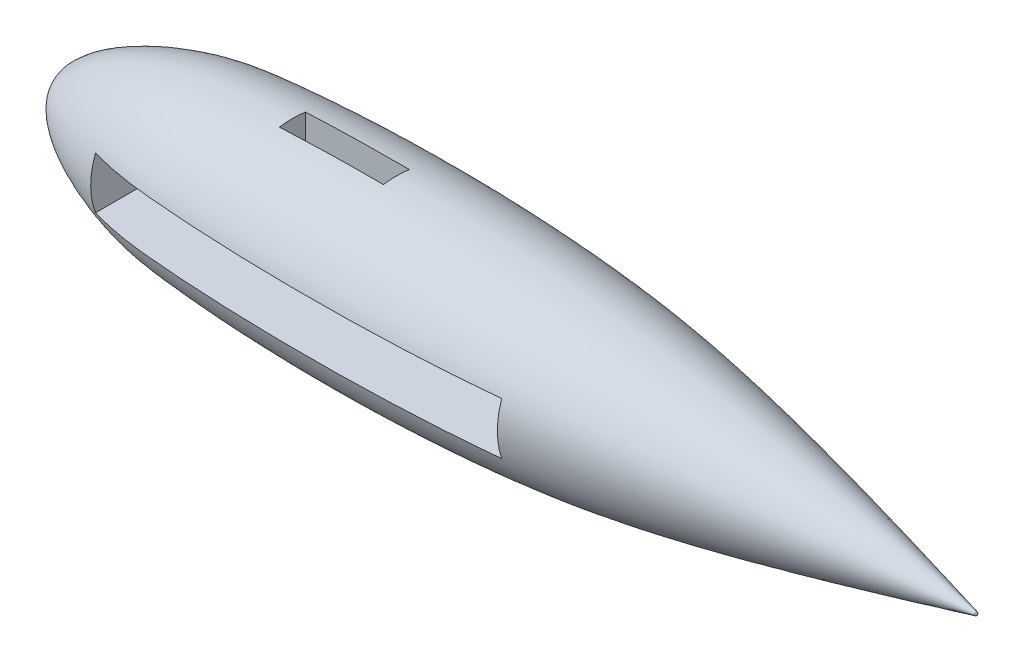
ISO-10303-21;
HEADER;
FILE_DESCRIPTION(('STEP AP214'),'2;1');
FILE_NAME('part.step','',(''),(''),'','','');
FILE_SCHEMA(('AUTOMOTIVE_DESIGN { 1 0 10303 214 1 1 1 1 }'));
ENDSEC;
DATA;
#1=APPLICATION_CONTEXT('core data for automotive mechanical design processes');
#2=APPLICATION_PROTOCOL_DEFINITION('international standard','automotive_design',2000,#1);
#3=PRODUCT_CONTEXT('',#1,'mechanical');
#4=PRODUCT('Part','Part','',(#3));
#5=PRODUCT_RELATED_PRODUCT_CATEGORY('part','',(#4));
#6=PRODUCT_DEFINITION_FORMATION('','',#4);
#7=PRODUCT_DEFINITION_CONTEXT('part definition',#1,'design');
#8=PRODUCT_DEFINITION('design','',#6,#7);
#9=PRODUCT_DEFINITION_SHAPE('','',#8);
#10=(LENGTH_UNIT() NAMED_UNIT(*) SI_UNIT(.MILLI.,.METRE.));
#11=(NAMED_UNIT(*) PLANE_ANGLE_UNIT() SI_UNIT($,.RADIAN.));
#12=(NAMED_UNIT(*) SI_UNIT($,.STERADIAN.) SOLID_ANGLE_UNIT());
#13=UNCERTAINTY_MEASURE_WITH_UNIT(LENGTH_MEASURE(1.E-05),#10,'distance_accuracy_value','');
#14=(GEOMETRIC_REPRESENTATION_CONTEXT(3) GLOBAL_UNCERTAINTY_ASSIGNED_CONTEXT((#13)) GLOBAL_UNIT_ASSIGNED_CONTEXT((#10,
#11,#12)) REPRESENTATION_CONTEXT('',''));
#15=CARTESIAN_POINT('',(0.,0.,0.));
#16=DIRECTION('',(0.,0.,1.));
#17=DIRECTION('',(1.,0.,0.));
#18=AXIS2_PLACEMENT_3D('',#15,#16,#17);
#19=CARTESIAN_POINT('',(0.45044252632428,0.,0.));
#20=CARTESIAN_POINT('',(0.,6.7020493413179,0.));
#21=CARTESIAN_POINT('',(17.5737566117754,14.4944071574045,0.));
#22=CARTESIAN_POINT('',(46.6106566839785,17.385837790923,0.));
#23=CARTESIAN_POINT('',(75.651736319701,17.6267824914608,0.));
#24=CARTESIAN_POINT('',(112.977699719094,14.5885243502068,0.));
#25=CARTESIAN_POINT('',(135.742421284718,10.6090067064801,0.));
#26=CARTESIAN_POINT('',(176.471935390002,0.309520890419368,0.));
#27=B_SPLINE_CURVE_WITH_KNOTS('',3,(#19,#20,#21,#22,#23,#24,#25,#26),.UNSPECIFIED.,.F.,.F.,(4,1,
1,1,1,4),(0.,0.220353686574068,0.288822514616333,0.640703195333059,0.716219452380384,1.),.UNSPECIFIED.);
#28=CARTESIAN_POINT('',(176.712929061975,0.,0.));
#29=DIRECTION('',(1.,0.,0.));
#30=AXIS1_PLACEMENT('',#28,#29);
#31=SURFACE_OF_REVOLUTION('',#27,#30);
#32=CARTESIAN_POINT('',(20.,0.,0.));
#33=DIRECTION('',(1.,0.,0.));
#34=DIRECTION('',(0.,0.,-1.));
#35=AXIS2_PLACEMENT_3D('',#32,#33,#34);
#36=CIRCLE('',#35,13.8129122586122);
#37=CARTESIAN_POINT('',(20.,5.,12.8762007231993));
#38=VERTEX_POINT('',#37);
#39=CARTESIAN_POINT('',(20.,-5.,12.8762007231993));
#40=VERTEX_POINT('',#39);
#41=EDGE_CURVE('E242',#38,#40,#36,.T.);
#42=ORIENTED_EDGE('',*,*,#41,.F.);
#43=CARTESIAN_POINT('',(100.,5.,14.7693033709271));
#44=CARTESIAN_POINT('',(99.2320997819811,5.,14.8474056514663));
#45=CARTESIAN_POINT('',(98.4638607603355,5.,14.9221561228864));
#46=CARTESIAN_POINT('',(96.9267885225317,5.,15.0651765407803));
#47=CARTESIAN_POINT('',(96.1579553134746,5.,15.133446563529));
#48=CARTESIAN_POINT('',(94.6201013879595,5.,15.2637020928435));
#49=CARTESIAN_POINT('',(93.8510809061805,5.,15.3256903752817));
#50=CARTESIAN_POINT('',(92.3125866361334,5.,15.4437791661826));
#51=CARTESIAN_POINT('',(91.5431128463426,5.,15.4998796547525));
#52=CARTESIAN_POINT('',(90.0039368275169,5.,15.6066865753795));
#53=CARTESIAN_POINT('',(89.2342346684394,5.,15.6573940176108));
#54=CARTESIAN_POINT('',(87.6945138957056,5.,15.7537153043367));
#55=CARTESIAN_POINT('',(86.9244952823434,5.,15.7993291535554));
#56=CARTESIAN_POINT('',(84.6180579263086,5.,15.9285377539632));
#57=CARTESIAN_POINT('',(83.0812217497942,5.,16.0047775394024));
#58=CARTESIAN_POINT('',(80.0065004810342,5.,16.1387155237309));
#59=CARTESIAN_POINT('',(78.4686152588898,5.,16.1964107065179));
#60=CARTESIAN_POINT('',(75.3918555742709,5.,16.2939959085604));
#61=CARTESIAN_POINT('',(73.8529809559141,5.,16.333881008936));
#62=CARTESIAN_POINT('',(70.8586834416668,5.,16.394588356689));
#63=CARTESIAN_POINT('',(69.4032790242696,5.,16.4163303189248));
#64=CARTESIAN_POINT('',(66.4921945155224,5.,16.4444664472923));
#65=CARTESIAN_POINT('',(65.036514411198,5.,16.4508592733085));
#66=CARTESIAN_POINT('',(62.1252567985215,5.,16.4482653919331));
#67=CARTESIAN_POINT('',(60.6696792893451,5.,16.4392796262379));
#68=CARTESIAN_POINT('',(57.7590061257728,5.,16.4056917867081));
#69=CARTESIAN_POINT('',(56.3039104341696,5.,16.3810929670366));
#70=CARTESIAN_POINT('',(53.3945848407447,5.,16.3158149394737));
#71=CARTESIAN_POINT('',(51.9403548137836,5.,16.2751413236625));
#72=CARTESIAN_POINT('',(49.0331391884299,5.,16.1769887353151));
#73=CARTESIAN_POINT('',(47.5801533264935,5.,16.1195176836536));
#74=CARTESIAN_POINT('',(45.3969702896374,5.,16.0196800729794));
#75=CARTESIAN_POINT('',(44.666462626863,5.,15.9840033162228));
#76=CARTESIAN_POINT('',(43.2056904515053,5.,15.9079344853219));
#77=CARTESIAN_POINT('',(42.4754259392521,5.,15.8675424048052));
#78=CARTESIAN_POINT('',(41.0151292007916,5.,15.7818300153914));
#79=CARTESIAN_POINT('',(40.2850969970496,5.,15.7365093237035));
#80=CARTESIAN_POINT('',(38.8253763426442,5.,15.6406950456375));
#81=CARTESIAN_POINT('',(38.095687889308,5.,15.5902015001697));
#82=CARTESIAN_POINT('',(37.0014207500273,5.,15.5103555372815));
#83=CARTESIAN_POINT('',(36.6366914615616,5.,15.4830545065083));
#84=CARTESIAN_POINT('',(35.9073404051844,5.,15.4270463124524));
#85=CARTESIAN_POINT('',(35.5427186373297,5.,15.3983391484285));
#86=CARTESIAN_POINT('',(34.8135782939116,5.,15.3394553684896));
#87=CARTESIAN_POINT('',(34.4490597233696,5.,15.3092786904244));
#88=CARTESIAN_POINT('',(33.7201449361296,5.,15.2474712606292));
#89=CARTESIAN_POINT('',(33.355748719698,5.,15.2158405057522));
#90=CARTESIAN_POINT('',(32.6271216942035,5.,15.1503217831569));
#91=CARTESIAN_POINT('',(32.2628909037032,5.,15.1164336055198));
#92=CARTESIAN_POINT('',(31.5347436511005,5.,15.0454694452309));
#93=CARTESIAN_POINT('',(31.1708271880256,5.,15.0083934724779));
#94=CARTESIAN_POINT('',(30.0797594244587,5.,14.8910309590277));
#95=CARTESIAN_POINT('',(29.3532341371204,5.,14.8046051037652));
#96=CARTESIAN_POINT('',(28.2650301293854,5.,14.6578649460794));
#97=CARTESIAN_POINT('',(27.9022017153991,5.,14.606041640808));
#98=CARTESIAN_POINT('',(27.1775044551219,5.,14.4960897888176));
#99=CARTESIAN_POINT('',(26.8156355876285,5.,14.4379613826278));
#100=CARTESIAN_POINT('',(26.0930510192756,5.,14.3148851065397));
#101=CARTESIAN_POINT('',(25.7323353371091,5.,14.2499371266689));
#102=CARTESIAN_POINT('',(25.0122709388221,5.,14.1128592039402));
#103=CARTESIAN_POINT('',(24.6529222132389,5.,14.0407293108932));
#104=CARTESIAN_POINT('',(23.9331242465444,5.,13.8884757925642));
#105=CARTESIAN_POINT('',(23.572686759028,5.,13.8082966048719));
#106=CARTESIAN_POINT('',(22.8534842696827,5.,13.6407404970974));
#107=CARTESIAN_POINT('',(22.494719298536,5.,13.5533634455151));
#108=CARTESIAN_POINT('',(21.778855541011,5.,13.3716477218684));
#109=CARTESIAN_POINT('',(21.4217572269364,5.,13.2773071903723));
#110=CARTESIAN_POINT('',(20.7094439383673,5.,13.0818232644988));
#111=CARTESIAN_POINT('',(20.3542288822945,5.,12.980680167434));
#112=CARTESIAN_POINT('',(20.,5.,12.8762007231993));
#113=B_SPLINE_CURVE_WITH_KNOTS('',3,(#43,#44,#45,#46,#47,#48,#49,#50,#51,#52,#53,#54,#55,#56,
#57,#58,#59,#60,#61,#62,#63,#64,#65,#66,#67,#68,#69,#70,#71,#72,#73,#74,#75,#76,#77,#78,#79,#80,
#81,#82,#83,#84,#85,#86,#87,#88,#89,#90,#91,#92,#93,#94,#95,#96,#97,#98,#99,#100,#101,#102,#103,
#104,#105,#106,#107,#108,#109,#110,#111,#112),.UNSPECIFIED.,.F.,.F.,(4,2,2,2,2,2,2,2,2,2,2,2,2,
2,2,2,2,2,2,2,2,2,2,2,2,2,2,2,2,2,2,2,2,2,4),(0.,2.31557515221017,4.63112304672583,
6.9456432079076,9.26017118877615,11.574264867785,13.8883564005017,18.5044039464249,
23.1212018689201,27.7392740948704,32.1058941837367,36.4728955033131,40.8396294223972,
45.2054535002389,49.5697601355821,53.9320120819941,56.1261346963466,58.3202602759161,
60.514556388706,62.7088351488918,63.8060818653745,64.9033291603244,66.0006229015972,
67.0979190178752,68.1953173151249,69.292712204911,71.4873345722729,72.5868207598213,
73.6862824468639,74.7857618665833,75.8852336612835,76.9928985063788,78.1005835922688,
79.2085655366882,80.316499087133),.UNSPECIFIED.);
#114=CARTESIAN_POINT('',(100.,5.,14.7693033709271));
#115=VERTEX_POINT('',#114);
#116=EDGE_CURVE('E209',#115,#38,#113,.T.);
#117=ORIENTED_EDGE('',*,*,#116,.F.);
#118=CARTESIAN_POINT('',(100.,0.,0.));
#119=DIRECTION('',(1.,0.,0.));
#120=DIRECTION('',(0.,0.,-1.));
#121=AXIS2_PLACEMENT_3D('',#118,#119,#120);
#122=CIRCLE('',#121,15.5927009226265);
#123=CARTESIAN_POINT('',(100.,-5.,14.7693033709271));
#124=VERTEX_POINT('',#123);
#125=EDGE_CURVE('E216',#124,#115,#122,.F.);
#126=ORIENTED_EDGE('',*,*,#125,.F.);
#127=CARTESIAN_POINT('',(20.,-5.,12.8762007231993));
#128=CARTESIAN_POINT('',(20.2759364321709,-5.,12.957594371191));
#129=CARTESIAN_POINT('',(20.5524726690161,-5.,13.0369564742137));
#130=CARTESIAN_POINT('',(21.1066969645776,-5.,13.1915667048276));
#131=CARTESIAN_POINT('',(21.3843850396347,-5.,13.2668147738383));
#132=CARTESIAN_POINT('',(21.9399478455996,-5.,13.412904565035));
#133=CARTESIAN_POINT('',(22.2178189991035,-5.,13.483759886954));
#134=CARTESIAN_POINT('',(22.7746057657592,-5.,13.6212369498713));
#135=CARTESIAN_POINT('',(23.0535213749098,-5.,13.6878587070708));
#136=CARTESIAN_POINT('',(23.6117159406968,-5.,13.8165955771195));
#137=CARTESIAN_POINT('',(23.890992582066,-5.,13.878720713288));
#138=CARTESIAN_POINT('',(24.4505101502373,-5.,13.9984529055076));
#139=CARTESIAN_POINT('',(24.7307510754223,-5.,14.0560599691313));
#140=CARTESIAN_POINT('',(25.5720762069474,-5.,14.2220771684247));
#141=CARTESIAN_POINT('',(26.1344820983307,-5.,14.3238490466571));
#142=CARTESIAN_POINT('',(27.2617995517009,-5.,14.5109919979993));
#143=CARTESIAN_POINT('',(27.8267102459235,-5.,14.5963683565712));
#144=CARTESIAN_POINT('',(28.9586410895182,-5.,14.7529639887095));
#145=CARTESIAN_POINT('',(29.5256618127358,-5.,14.8241790727666));
#146=CARTESIAN_POINT('',(30.6589239198864,-5.,14.9550491839115));
#147=CARTESIAN_POINT('',(31.2251606315988,-5.,15.0147453335615));
#148=CARTESIAN_POINT('',(32.0752681651095,-5.,15.0983532471791));
#149=CARTESIAN_POINT('',(32.3588539608748,-5.,15.1252408481211));
#150=CARTESIAN_POINT('',(32.9261701213314,-5.,15.1774521129908));
#151=CARTESIAN_POINT('',(33.2099004862206,-5.,15.2027757747701));
#152=CARTESIAN_POINT('',(33.7776280107122,-5.,15.2523433991984));
#153=CARTESIAN_POINT('',(34.0616252277889,-5.,15.2765866981453));
#154=CARTESIAN_POINT('',(34.6296926383798,-5.,15.3241977152486));
#155=CARTESIAN_POINT('',(34.9137628318052,-5.,15.3475654344644));
#156=CARTESIAN_POINT('',(35.7663362574667,-5.,15.416356457807));
#157=CARTESIAN_POINT('',(36.3349476146615,-5.,15.4604454704443));
#158=CARTESIAN_POINT('',(37.4725733635461,-5.,15.5452748806157));
#159=CARTESIAN_POINT('',(38.0415878225137,-5.,15.5860143739471));
#160=CARTESIAN_POINT('',(39.1798854314411,-5.,15.6642716512418));
#161=CARTESIAN_POINT('',(39.7491686000326,-5.,15.7017891628618));
#162=CARTESIAN_POINT('',(41.9686401428092,-5.,15.8420182476035));
#163=CARTESIAN_POINT('',(43.6195621036875,-5.,15.9333123037888));
#164=CARTESIAN_POINT('',(46.9218131602162,-5.,16.0924053608987));
#165=CARTESIAN_POINT('',(48.5731417845797,-5.,16.1602143314687));
#166=CARTESIAN_POINT('',(51.8760468882561,-5.,16.27403121514));
#167=CARTESIAN_POINT('',(53.5276231412506,-5.,16.3200457209649));
#168=CARTESIAN_POINT('',(56.8308554086468,-5.,16.3913939841439));
#169=CARTESIAN_POINT('',(58.4825113260942,-5.,16.4167322754553));
#170=CARTESIAN_POINT('',(61.7857490033242,-5.,16.4473877042534));
#171=CARTESIAN_POINT('',(63.4373307342828,-5.,16.452707973385));
#172=CARTESIAN_POINT('',(66.7402724743822,-5.,16.4436007607626));
#173=CARTESIAN_POINT('',(68.39163248908,-5.,16.4291752715619));
#174=CARTESIAN_POINT('',(71.7089098972439,-5.,16.3802787897386));
#175=CARTESIAN_POINT('',(73.3748246675848,-5.,16.3456287135482));
#176=CARTESIAN_POINT('',(76.7062560298006,-5.,16.2557018268638));
#177=CARTESIAN_POINT('',(78.3717725690121,-5.,16.2004230628691));
#178=CARTESIAN_POINT('',(81.7022727754215,-5.,16.0684200395844));
#179=CARTESIAN_POINT('',(83.3672562886812,-5.,15.9916918455119));
#180=CARTESIAN_POINT('',(85.8640664113216,-5.,15.8595690929151));
#181=CARTESIAN_POINT('',(86.6963497748991,-5.,15.8126814947075));
#182=CARTESIAN_POINT('',(88.3605671205026,-5.,15.7130231310634));
#183=CARTESIAN_POINT('',(89.1925011020183,-5.,15.6602523570635));
#184=CARTESIAN_POINT('',(90.8563324634692,-5.,15.5485638533925));
#185=CARTESIAN_POINT('',(91.6882296591492,-5.,15.4896433735804));
#186=CARTESIAN_POINT('',(93.3515164884076,-5.,15.3650533066009));
#187=CARTESIAN_POINT('',(94.1829061242409,-5.,15.2993837496416));
#188=CARTESIAN_POINT('',(95.8456556959919,-5.,15.1607488448969));
#189=CARTESIAN_POINT('',(96.6770152159769,-5.,15.087778496638));
#190=CARTESIAN_POINT('',(98.339048609206,-5.,14.9342819145158));
#191=CARTESIAN_POINT('',(99.1697224719223,-5.,14.8537555667356));
#192=CARTESIAN_POINT('',(100.,-5.,14.7693033709271));
#193=B_SPLINE_CURVE_WITH_KNOTS('',3,(#127,#128,#129,#130,#131,#132,#133,#134,#135,#136,#137,
#138,#139,#140,#141,#142,#143,#144,#145,#146,#147,#148,#149,#150,#151,#152,#153,#154,#155,#156,
#157,#158,#159,#160,#161,#162,#163,#164,#165,#166,#167,#168,#169,#170,#171,#172,#173,#174,#175,
#176,#177,#178,#179,#180,#181,#182,#183,#184,#185,#186,#187,#188,#189,#190,#191,#192),
.UNSPECIFIED.,.F.,.F.,(4,2,2,2,2,2,2,2,2,2,2,2,2,2,2,2,2,2,2,2,2,2,2,2,2,2,2,2,2,2,2,2,4),(0.,
0.863064545567076,1.72614137727696,2.58639691814054,3.44664916674626,4.30492069147052,
5.16319077763599,6.87751745551718,8.59129055072484,10.3055699012995,12.0136112116585,
12.8681810081224,13.7227519785325,14.5778408995366,15.4329287857858,17.1438715912814,
18.8552747594896,20.5668224447297,25.5269455217905,30.4849603904335,35.4414745234329,
40.3969014812555,45.3515531735181,50.3057049265239,55.3044046097188,60.3035777812418,
65.3036686266325,67.8044607191056,70.3052564516829,72.8071753681162,75.3090830866865,
77.8127163031537,80.3163872713389),.UNSPECIFIED.);
#194=EDGE_CURVE('E236',#40,#124,#193,.T.);
#195=ORIENTED_EDGE('',*,*,#194,.F.);
#196=EDGE_LOOP('',(#42,#117,#126,#195));
#197=FACE_BOUND('',#196,.T.);
#198=CARTESIAN_POINT('',(176.471881523389,0.,0.));
#199=DIRECTION('',(1.,0.,0.));
#200=DIRECTION('',(0.,0.,-1.));
#201=AXIS2_PLACEMENT_3D('',#198,#199,#200);
#202=CIRCLE('',#201,0.30953450696548);
#203=CARTESIAN_POINT('',(176.471881523389,0.,-0.30953450696548));
#204=VERTEX_POINT('',#203);
#205=EDGE_CURVE('E199',#204,#204,#202,.T.);
#206=ORIENTED_EDGE('',*,*,#205,.F.);
#207=EDGE_LOOP('',(#206));
#208=FACE_BOUND('',#207,.T.);
#209=CARTESIAN_POINT('',(0.45044252632428,0.,0.));
#210=VERTEX_POINT('',#209);
#211=VERTEX_LOOP('',#210);
#212=FACE_BOUND('',#211,.T.);
#213=CARTESIAN_POINT('',(100.,5.,-14.7693033709271));
#214=CARTESIAN_POINT('',(99.2320997819811,5.,-14.8474056514663));
#215=CARTESIAN_POINT('',(98.4638607603355,5.,-14.9221561228864));
#216=CARTESIAN_POINT('',(96.9267885225317,5.,-15.0651765407803));
#217=CARTESIAN_POINT('',(96.1579553134746,5.,-15.133446563529));
#218=CARTESIAN_POINT('',(94.6201013879595,5.,-15.2637020928435));
#219=CARTESIAN_POINT('',(93.8510809061805,5.,-15.3256903752817));
#220=CARTESIAN_POINT('',(92.3125866361334,5.,-15.4437791661826));
#221=CARTESIAN_POINT('',(91.5431128463426,5.,-15.4998796547525));
#222=CARTESIAN_POINT('',(90.0039368275169,5.,-15.6066865753795));
#223=CARTESIAN_POINT('',(89.2342346684394,5.,-15.6573940176108));
#224=CARTESIAN_POINT('',(87.6945138957056,5.,-15.7537153043367));
#225=CARTESIAN_POINT('',(86.9244952823434,5.,-15.7993291535554));
#226=CARTESIAN_POINT('',(84.6180579263085,5.,-15.9285377539632));
#227=CARTESIAN_POINT('',(83.0812217497942,5.,-16.0047775394024));
#228=CARTESIAN_POINT('',(80.0065004810342,5.,-16.1387155237309));
#229=CARTESIAN_POINT('',(78.4686152588897,5.,-16.1964107065179));
#230=CARTESIAN_POINT('',(75.3918555742709,5.,-16.2939959085604));
#231=CARTESIAN_POINT('',(73.8529809559141,5.,-16.333881008936));
#232=CARTESIAN_POINT('',(70.8586834416668,5.,-16.394588356689));
#233=CARTESIAN_POINT('',(69.4032790242696,5.,-16.4163303189248));
#234=CARTESIAN_POINT('',(66.4921945155224,5.,-16.4444664472923));
#235=CARTESIAN_POINT('',(65.036514411198,5.,-16.4508592733085));
#236=CARTESIAN_POINT('',(62.1252567985215,5.,-16.4482653919331));
#237=CARTESIAN_POINT('',(60.6696792893451,5.,-16.4392796262379));
#238=CARTESIAN_POINT('',(57.7590061257728,5.,-16.4056917867081));
#239=CARTESIAN_POINT('',(56.3039104341696,5.,-16.3810929670366));
#240=CARTESIAN_POINT('',(53.3945848407447,5.,-16.3158149394737));
#241=CARTESIAN_POINT('',(51.9403548137836,5.,-16.2751413236625));
#242=CARTESIAN_POINT('',(49.0331391884299,5.,-16.1769887353151));
#243=CARTESIAN_POINT('',(47.5801533264935,5.,-16.1195176836536));
#244=CARTESIAN_POINT('',(45.3969702896374,5.,-16.0196800729794));
#245=CARTESIAN_POINT('',(44.666462626863,5.,-15.9840033162228));
#246=CARTESIAN_POINT('',(43.2056904515053,5.,-15.9079344853219));
#247=CARTESIAN_POINT('',(42.475425939252,5.,-15.8675424048052));
#248=CARTESIAN_POINT('',(41.0151292007915,5.,-15.7818300153914));
#249=CARTESIAN_POINT('',(40.2850969970496,5.,-15.7365093237035));
#250=CARTESIAN_POINT('',(38.8253763426442,5.,-15.6406950456375));
#251=CARTESIAN_POINT('',(38.095687889308,5.,-15.5902015001697));
#252=CARTESIAN_POINT('',(37.0014207500273,5.,-15.5103555372815));
#253=CARTESIAN_POINT('',(36.6366914615616,5.,-15.4830545065083));
#254=CARTESIAN_POINT('',(35.9073404051844,5.,-15.4270463124524));
#255=CARTESIAN_POINT('',(35.5427186373297,5.,-15.3983391484285));
#256=CARTESIAN_POINT('',(34.8135782939116,5.,-15.3394553684896));
#257=CARTESIAN_POINT('',(34.4490597233696,5.,-15.3092786904244));
#258=CARTESIAN_POINT('',(33.7201449361296,5.,-15.2474712606292));
#259=CARTESIAN_POINT('',(33.355748719698,5.,-15.2158405057522));
#260=CARTESIAN_POINT('',(32.6271216942034,5.,-15.1503217831569));
#261=CARTESIAN_POINT('',(32.2628909037031,5.,-15.1164336055198));
#262=CARTESIAN_POINT('',(31.5347436511004,5.,-15.0454694452309));
#263=CARTESIAN_POINT('',(31.1708271880256,5.,-15.0083934724779));
#264=CARTESIAN_POINT('',(30.0797594244587,5.,-14.8910309590277));
#265=CARTESIAN_POINT('',(29.3532341371204,5.,-14.8046051037652));
#266=CARTESIAN_POINT('',(28.2650301293853,5.,-14.6578649460794));
#267=CARTESIAN_POINT('',(27.9022017153991,5.,-14.606041640808));
#268=CARTESIAN_POINT('',(27.1775044551219,5.,-14.4960897888176));
#269=CARTESIAN_POINT('',(26.8156355876285,5.,-14.4379613826277));
#270=CARTESIAN_POINT('',(26.0930510192756,5.,-14.3148851065397));
#271=CARTESIAN_POINT('',(25.7323353371091,5.,-14.2499371266689));
#272=CARTESIAN_POINT('',(25.0122709388221,5.,-14.1128592039402));
#273=CARTESIAN_POINT('',(24.6529222132389,5.,-14.0407293108932));
#274=CARTESIAN_POINT('',(23.9331242465444,5.,-13.8884757925642));
#275=CARTESIAN_POINT('',(23.572686759028,5.,-13.8082966048719));
#276=CARTESIAN_POINT('',(22.8534842696826,5.,-13.6407404970974));
#277=CARTESIAN_POINT('',(22.494719298536,5.,-13.5533634455151));
#278=CARTESIAN_POINT('',(21.778855541011,5.,-13.3716477218684));
#279=CARTESIAN_POINT('',(21.4217572269363,5.,-13.2773071903723));
#280=CARTESIAN_POINT('',(20.7094439383673,5.,-13.0818232644988));
#281=CARTESIAN_POINT('',(20.3542288822945,5.,-12.980680167434));
#282=CARTESIAN_POINT('',(20.,5.,-12.8762007231993));
#283=B_SPLINE_CURVE_WITH_KNOTS('',3,(#213,#214,#215,#216,#217,#218,#219,#220,#221,#222,#223,
#224,#225,#226,#227,#228,#229,#230,#231,#232,#233,#234,#235,#236,#237,#238,#239,#240,#241,#242,
#243,#244,#245,#246,#247,#248,#249,#250,#251,#252,#253,#254,#255,#256,#257,#258,#259,#260,#261,
#262,#263,#264,#265,#266,#267,#268,#269,#270,#271,#272,#273,#274,#275,#276,#277,#278,#279,#280,
#281,#282),.UNSPECIFIED.,.F.,.F.,(4,2,2,2,2,2,2,2,2,2,2,2,2,2,2,2,2,2,2,2,2,2,2,2,2,2,2,2,2,2,2,
2,2,2,4),(0.,2.31557515221017,4.63112304672583,6.94564320790757,9.26017118877614,
11.5742648677851,13.8883564005017,18.5044039464249,23.1212018689202,27.7392740948705,
32.1058941837367,36.4728955033131,40.8396294223973,45.205453500239,49.5697601355821,
53.9320120819942,56.1261346963467,58.3202602759162,60.514556388706,62.7088351488918,
63.8060818653745,64.9033291603244,66.0006229015972,67.0979190178752,68.1953173151249,
69.2927122049111,71.4873345722729,72.5868207598213,73.6862824468639,74.7857618665833,
75.8852336612835,76.9928985063788,78.1005835922688,79.2085655366882,80.3164990871331),.UNSPECIFIED.);
#284=CARTESIAN_POINT('',(100.,5.,-14.7693033709271));
#285=VERTEX_POINT('',#284);
#286=CARTESIAN_POINT('',(20.,5.,-12.8762007231993));
#287=VERTEX_POINT('',#286);
#288=EDGE_CURVE('E270',#285,#287,#283,.T.);
#289=ORIENTED_EDGE('',*,*,#288,.T.);
#290=CARTESIAN_POINT('',(20.,0.,0.));
#291=DIRECTION('',(1.,0.,0.));
#292=DIRECTION('',(0.,0.,-1.));
#293=AXIS2_PLACEMENT_3D('',#290,#291,#292);
#294=CIRCLE('',#293,13.8129122586122);
#295=CARTESIAN_POINT('',(20.,-5.,-12.8762007231993));
#296=VERTEX_POINT('',#295);
#297=EDGE_CURVE('E277',#287,#296,#294,.F.);
#298=ORIENTED_EDGE('',*,*,#297,.T.);
#299=CARTESIAN_POINT('',(20.,-5.,-12.8762007231993));
#300=CARTESIAN_POINT('',(20.2759364321709,-5.,-12.957594371191));
#301=CARTESIAN_POINT('',(20.5524726690161,-5.,-13.0369564742137));
#302=CARTESIAN_POINT('',(21.1066969645776,-5.,-13.1915667048276));
#303=CARTESIAN_POINT('',(21.3843850396347,-5.,-13.2668147738383));
#304=CARTESIAN_POINT('',(21.9399478455996,-5.,-13.412904565035));
#305=CARTESIAN_POINT('',(22.2178189991035,-5.,-13.483759886954));
#306=CARTESIAN_POINT('',(22.7746057657592,-5.,-13.6212369498713));
#307=CARTESIAN_POINT('',(23.0535213749098,-5.,-13.6878587070708));
#308=CARTESIAN_POINT('',(23.6117159406968,-5.,-13.8165955771195));
#309=CARTESIAN_POINT('',(23.890992582066,-5.,-13.878720713288));
#310=CARTESIAN_POINT('',(24.4505101502373,-5.,-13.9984529055076));
#311=CARTESIAN_POINT('',(24.7307510754223,-5.,-14.0560599691313));
#312=CARTESIAN_POINT('',(25.5720762069474,-5.,-14.2220771684247));
#313=CARTESIAN_POINT('',(26.1344820983307,-5.,-14.3238490466571));
#314=CARTESIAN_POINT('',(27.261799551701,-5.,-14.5109919979993));
#315=CARTESIAN_POINT('',(27.8267102459235,-5.,-14.5963683565712));
#316=CARTESIAN_POINT('',(28.9586410895182,-5.,-14.7529639887095));
#317=CARTESIAN_POINT('',(29.5256618127358,-5.,-14.8241790727666));
#318=CARTESIAN_POINT('',(30.6589239198864,-5.,-14.9550491839115));
#319=CARTESIAN_POINT('',(31.2251606315988,-5.,-15.0147453335615));
#320=CARTESIAN_POINT('',(32.0752681651095,-5.,-15.0983532471791));
#321=CARTESIAN_POINT('',(32.3588539608748,-5.,-15.1252408481211));
#322=CARTESIAN_POINT('',(32.9261701213314,-5.,-15.1774521129909));
#323=CARTESIAN_POINT('',(33.2099004862206,-5.,-15.2027757747701));
#324=CARTESIAN_POINT('',(33.7776280107122,-5.,-15.2523433991984));
#325=CARTESIAN_POINT('',(34.0616252277889,-5.,-15.2765866981453));
#326=CARTESIAN_POINT('',(34.6296926383798,-5.,-15.3241977152486));
#327=CARTESIAN_POINT('',(34.9137628318052,-5.,-15.3475654344644));
#328=CARTESIAN_POINT('',(35.7663362574667,-5.,-15.416356457807));
#329=CARTESIAN_POINT('',(36.3349476146615,-5.,-15.4604454704444));
#330=CARTESIAN_POINT('',(37.4725733635461,-5.,-15.5452748806157));
#331=CARTESIAN_POINT('',(38.0415878225137,-5.,-15.5860143739471));
#332=CARTESIAN_POINT('',(39.1798854314411,-5.,-15.6642716512418));
#333=CARTESIAN_POINT('',(39.7491686000326,-5.,-15.7017891628618));
#334=CARTESIAN_POINT('',(41.9686401428093,-5.,-15.8420182476035));
#335=CARTESIAN_POINT('',(43.6195621036875,-5.,-15.9333123037888));
#336=CARTESIAN_POINT('',(46.9218131602162,-5.,-16.0924053608987));
#337=CARTESIAN_POINT('',(48.5731417845797,-5.,-16.1602143314687));
#338=CARTESIAN_POINT('',(51.8760468882561,-5.,-16.27403121514));
#339=CARTESIAN_POINT('',(53.5276231412506,-5.,-16.3200457209649));
#340=CARTESIAN_POINT('',(56.8308554086469,-5.,-16.3913939841439));
#341=CARTESIAN_POINT('',(58.4825113260942,-5.,-16.4167322754553));
#342=CARTESIAN_POINT('',(61.7857490033242,-5.,-16.4473877042534));
#343=CARTESIAN_POINT('',(63.4373307342828,-5.,-16.452707973385));
#344=CARTESIAN_POINT('',(66.7402724743822,-5.,-16.4436007607626));
#345=CARTESIAN_POINT('',(68.39163248908,-5.,-16.4291752715619));
#346=CARTESIAN_POINT('',(71.7089098972439,-5.,-16.3802787897386));
#347=CARTESIAN_POINT('',(73.3748246675848,-5.,-16.3456287135482));
#348=CARTESIAN_POINT('',(76.7062560298006,-5.,-16.2557018268638));
#349=CARTESIAN_POINT('',(78.3717725690121,-5.,-16.2004230628691));
#350=CARTESIAN_POINT('',(81.7022727754215,-5.,-16.0684200395844));
#351=CARTESIAN_POINT('',(83.3672562886812,-5.,-15.9916918455119));
#352=CARTESIAN_POINT('',(85.8640664113216,-5.,-15.8595690929151));
#353=CARTESIAN_POINT('',(86.6963497748991,-5.,-15.8126814947075));
#354=CARTESIAN_POINT('',(88.3605671205026,-5.,-15.7130231310634));
#355=CARTESIAN_POINT('',(89.1925011020183,-5.,-15.6602523570635));
#356=CARTESIAN_POINT('',(90.8563324634692,-5.,-15.5485638533925));
#357=CARTESIAN_POINT('',(91.6882296591492,-5.,-15.4896433735804));
#358=CARTESIAN_POINT('',(93.3515164884076,-5.,-15.3650533066009));
#359=CARTESIAN_POINT('',(94.1829061242409,-5.,-15.2993837496416));
#360=CARTESIAN_POINT('',(95.8456556959919,-5.,-15.1607488448969));
#361=CARTESIAN_POINT('',(96.6770152159769,-5.,-15.087778496638));
#362=CARTESIAN_POINT('',(98.339048609206,-5.,-14.9342819145158));
#363=CARTESIAN_POINT('',(99.1697224719223,-5.,-14.8537555667356));
#364=CARTESIAN_POINT('',(100.,-5.,-14.7693033709271));
#365=B_SPLINE_CURVE_WITH_KNOTS('',3,(#299,#300,#301,#302,#303,#304,#305,#306,#307,#308,#309,
#310,#311,#312,#313,#314,#315,#316,#317,#318,#319,#320,#321,#322,#323,#324,#325,#326,#327,#328,
#329,#330,#331,#332,#333,#334,#335,#336,#337,#338,#339,#340,#341,#342,#343,#344,#345,#346,#347,
#348,#349,#350,#351,#352,#353,#354,#355,#356,#357,#358,#359,#360,#361,#362,#363,#364),
.UNSPECIFIED.,.F.,.F.,(4,2,2,2,2,2,2,2,2,2,2,2,2,2,2,2,2,2,2,2,2,2,2,2,2,2,2,2,2,2,2,2,4),(0.,
0.863064545567075,1.72614137727696,2.58639691814054,3.44664916674626,4.30492069147052,
5.16319077763599,6.87751745551718,8.59129055072484,10.3055699012995,12.0136112116585,
12.8681810081224,13.7227519785325,14.5778408995366,15.4329287857858,17.1438715912814,
18.8552747594896,20.5668224447297,25.5269455217905,30.4849603904335,35.4414745234329,
40.3969014812555,45.3515531735181,50.3057049265239,55.3044046097188,60.3035777812417,
65.3036686266324,67.8044607191056,70.3052564516829,72.8071753681161,75.3090830866865,
77.8127163031537,80.3163872713389),.UNSPECIFIED.);
#366=CARTESIAN_POINT('',(100.,-5.,-14.7693033709271));
#367=VERTEX_POINT('',#366);
#368=EDGE_CURVE('E244',#296,#367,#365,.T.);
#369=ORIENTED_EDGE('',*,*,#368,.T.);
#370=CARTESIAN_POINT('',(100.,0.,0.));
#371=DIRECTION('',(1.,0.,0.));
#372=DIRECTION('',(0.,0.,-1.));
#373=AXIS2_PLACEMENT_3D('',#370,#371,#372);
#374=CIRCLE('',#373,15.5927009226265);
#375=EDGE_CURVE('E252',#367,#285,#374,.T.);
#376=ORIENTED_EDGE('',*,*,#375,.T.);
#377=EDGE_LOOP('',(#289,#298,#369,#376));
#378=FACE_BOUND('',#377,.T.);
#379=CARTESIAN_POINT('',(45.,0.,0.));
#380=DIRECTION('',(1.,0.,0.));
#381=DIRECTION('',(0.,0.,-1.));
#382=AXIS2_PLACEMENT_3D('',#379,#380,#381);
#383=CIRCLE('',#382,16.762779050344);
#384=CARTESIAN_POINT('',(45.,16.5753057736698,-2.5));
#385=VERTEX_POINT('',#384);
#386=CARTESIAN_POINT('',(45.,16.5753057736698,2.5));
#387=VERTEX_POINT('',#386);
#388=EDGE_CURVE('E11',#385,#387,#383,.T.);
#389=ORIENTED_EDGE('',*,*,#388,.F.);
#390=CARTESIAN_POINT('',(65.,17.008807205462,-2.5));
#391=CARTESIAN_POINT('',(64.3330165519807,17.0104454684504,-2.5));
#392=CARTESIAN_POINT('',(63.6660291935016,17.0105270948224,-2.5));
#393=CARTESIAN_POINT('',(62.3321242771384,17.0075596565043,-2.5));
#394=CARTESIAN_POINT('',(61.6652067185971,17.0045108866867,-2.5));
#395=CARTESIAN_POINT('',(60.3314415003418,16.9952658869403,-2.5));
#396=CARTESIAN_POINT('',(59.6645938390566,16.9890698841566,-2.5));
#397=CARTESIAN_POINT('',(58.3309686615352,16.9735017673664,-2.5));
#398=CARTESIAN_POINT('',(57.6641911434602,16.9641298111047,-2.5));
#399=CARTESIAN_POINT('',(56.3307065708281,16.942171761023,-2.5));
#400=CARTESIAN_POINT('',(55.6639995148756,16.9295857520693,-2.5));
#401=CARTESIAN_POINT('',(54.3306504891449,16.9011505688277,-2.5));
#402=CARTESIAN_POINT('',(53.6640085198271,16.8853013729286,-2.5));
#403=CARTESIAN_POINT('',(52.3307968928459,16.8502796052713,-2.5));
#404=CARTESIAN_POINT('',(51.6642272371261,16.831106959424,-2.5));
#405=CARTESIAN_POINT('',(50.3311627076671,16.7893651443902,-2.5));
#406=CARTESIAN_POINT('',(49.6646678389365,16.766795815082,-2.5));
#407=CARTESIAN_POINT('',(48.3317556371854,16.7181748642788,-2.5));
#408=CARTESIAN_POINT('',(47.6653383135161,16.6921229859359,-2.5));
#409=CARTESIAN_POINT('',(46.3325851302014,16.6364312432372,-2.5));
#410=CARTESIAN_POINT('',(45.6662492859541,16.6067910106252,-2.5));
#411=CARTESIAN_POINT('',(45.,16.5753057736698,-2.5));
#412=B_SPLINE_CURVE_WITH_KNOTS('',3,(#390,#391,#392,#393,#394,#395,#396,#397,#398,#399,#400,
#401,#402,#403,#404,#405,#406,#407,#408,#409,#410,#411),.UNSPECIFIED.,.F.,.F.,(4,2,2,2,2,2,2,2,
2,2,4),(0.,2.00095468950552,4.00172091334281,6.00234275645041,8.00286524615187,10.0033349179132,
12.0038178387232,14.0043453616712,16.004967220163,18.0057367117022,20.0067117072751),.UNSPECIFIED.);
#413=CARTESIAN_POINT('',(65.,17.008807205462,-2.5));
#414=VERTEX_POINT('',#413);
#415=EDGE_CURVE('E280',#414,#385,#412,.T.);
#416=ORIENTED_EDGE('',*,*,#415,.F.);
#417=CARTESIAN_POINT('',(65.,0.,0.));
#418=DIRECTION('',(1.,0.,0.));
#419=DIRECTION('',(0.,0.,-1.));
#420=AXIS2_PLACEMENT_3D('',#417,#418,#419);
#421=CIRCLE('',#420,17.1915538143757);
#422=CARTESIAN_POINT('',(65.,17.008807205462,2.5));
#423=VERTEX_POINT('',#422);
#424=EDGE_CURVE('E287',#423,#414,#421,.F.);
#425=ORIENTED_EDGE('',*,*,#424,.F.);
#426=CARTESIAN_POINT('',(45.,16.5753057736698,2.5));
#427=CARTESIAN_POINT('',(45.6662492859541,16.6067910106252,2.5));
#428=CARTESIAN_POINT('',(46.3325851302014,16.6364312432372,2.5));
#429=CARTESIAN_POINT('',(47.6653383135161,16.6921229859359,2.5));
#430=CARTESIAN_POINT('',(48.3317556371854,16.7181748642789,2.5));
#431=CARTESIAN_POINT('',(49.6646678389365,16.766795815082,2.5));
#432=CARTESIAN_POINT('',(50.3311627076671,16.7893651443902,2.5));
#433=CARTESIAN_POINT('',(51.6642272371261,16.831106959424,2.5));
#434=CARTESIAN_POINT('',(52.3307968928459,16.8502796052713,2.5));
#435=CARTESIAN_POINT('',(53.6640085198271,16.8853013729286,2.5));
#436=CARTESIAN_POINT('',(54.3306504891449,16.9011505688277,2.5));
#437=CARTESIAN_POINT('',(55.6639995148756,16.9295857520693,2.5));
#438=CARTESIAN_POINT('',(56.3307065708281,16.942171761023,2.5));
#439=CARTESIAN_POINT('',(57.6641911434602,16.9641298111047,2.5));
#440=CARTESIAN_POINT('',(58.3309686615352,16.9735017673664,2.5));
#441=CARTESIAN_POINT('',(59.6645938390566,16.9890698841566,2.5));
#442=CARTESIAN_POINT('',(60.3314415003418,16.9952658869403,2.5));
#443=CARTESIAN_POINT('',(61.6652067185971,17.0045108866867,2.5));
#444=CARTESIAN_POINT('',(62.3321242771384,17.0075596565043,2.5));
#445=CARTESIAN_POINT('',(63.6660291935016,17.0105270948224,2.5));
#446=CARTESIAN_POINT('',(64.3330165519807,17.0104454684504,2.5));
#447=CARTESIAN_POINT('',(65.,17.008807205462,2.5));
#448=B_SPLINE_CURVE_WITH_KNOTS('',3,(#426,#427,#428,#429,#430,#431,#432,#433,#434,#435,#436,
#437,#438,#439,#440,#441,#442,#443,#444,#445,#446,#447),.UNSPECIFIED.,.F.,.F.,(4,2,2,2,2,2,2,2,
2,2,4),(0.,2.00097499557289,4.0017444871121,6.00236634560387,8.00289386855193,10.0033767893619,
12.0038464611232,14.0043689508247,16.0049907939323,18.0057570177696,20.0067117072751),.UNSPECIFIED.);
#449=EDGE_CURVE('E48',#387,#423,#448,.T.);
#450=ORIENTED_EDGE('',*,*,#449,.F.);
#451=EDGE_LOOP('',(#389,#416,#425,#450));
#452=FACE_BOUND('',#451,.T.);
#453=ADVANCED_FACE('F39',(#197,#208,#212,#378,#452),#31,.T.);
#454=CARTESIAN_POINT('',(176.393665219324,0.,0.));
#455=DIRECTION('',(1.,0.,0.));
#456=DIRECTION('',(0.,1.,0.));
#457=AXIS2_PLACEMENT_3D('',#454,#455,#456);
#458=SPHERICAL_SURFACE('',#457,0.319263842650485);
#459=ORIENTED_EDGE('',*,*,#205,.T.);
#460=EDGE_LOOP('',(#459));
#461=FACE_BOUND('',#460,.T.);
#462=ADVANCED_FACE('F307',(#461),#458,.T.);
#463=CARTESIAN_POINT('',(20.,-5.,17.6267824914608));
#464=DIRECTION('',(1.,0.,0.));
#465=DIRECTION('',(0.,0.,-1.));
#466=AXIS2_PLACEMENT_3D('',#463,#464,#465);
#467=PLANE('',#466);
#468=ORIENTED_EDGE('',*,*,#41,.T.);
#469=DIRECTION('',(0.,0.,-1.));
#470=VECTOR('',#469,1.);
#471=CARTESIAN_POINT('',(20.,-5.,17.6267824914608));
#472=LINE('',#471,#470);
#473=CARTESIAN_POINT('',(20.,-5.,3.));
#474=VERTEX_POINT('',#473);
#475=EDGE_CURVE('E198',#40,#474,#472,.T.);
#476=ORIENTED_EDGE('',*,*,#475,.T.);
#477=DIRECTION('',(0.,-1.,0.));
#478=VECTOR('',#477,1.);
#479=CARTESIAN_POINT('',(20.,-5.,3.));
#480=LINE('',#479,#478);
#481=CARTESIAN_POINT('',(20.,5.,3.));
#482=VERTEX_POINT('',#481);
#483=EDGE_CURVE('E180',#482,#474,#480,.T.);
#484=ORIENTED_EDGE('',*,*,#483,.F.);
#485=DIRECTION('',(0.,0.,-1.));
#486=VECTOR('',#485,1.);
#487=CARTESIAN_POINT('',(20.,5.,17.6267824914608));
#488=LINE('',#487,#486);
#489=EDGE_CURVE('E192',#38,#482,#488,.T.);
#490=ORIENTED_EDGE('',*,*,#489,.F.);
#491=EDGE_LOOP('',(#468,#476,#484,#490));
#492=FACE_BOUND('',#491,.T.);
#493=ADVANCED_FACE('F234',(#492),#467,.T.);
#494=CARTESIAN_POINT('',(100.,-5.,17.6267824914608));
#495=DIRECTION('',(0.,1.,0.));
#496=DIRECTION('',(0.,0.,1.));
#497=AXIS2_PLACEMENT_3D('',#494,#495,#496);
#498=PLANE('',#497);
#499=ORIENTED_EDGE('',*,*,#194,.T.);
#500=DIRECTION('',(0.,0.,-1.));
#501=VECTOR('',#500,1.);
#502=CARTESIAN_POINT('',(100.,-5.,17.6267824914608));
#503=LINE('',#502,#501);
#504=CARTESIAN_POINT('',(100.,-5.,3.));
#505=VERTEX_POINT('',#504);
#506=EDGE_CURVE('E196',#124,#505,#503,.T.);
#507=ORIENTED_EDGE('',*,*,#506,.T.);
#508=DIRECTION('',(1.,0.,0.));
#509=VECTOR('',#508,1.);
#510=CARTESIAN_POINT('',(100.,-5.,3.));
#511=LINE('',#510,#509);
#512=EDGE_CURVE('E183',#474,#505,#511,.T.);
#513=ORIENTED_EDGE('',*,*,#512,.F.);
#514=ORIENTED_EDGE('',*,*,#475,.F.);
#515=EDGE_LOOP('',(#499,#507,#513,#514));
#516=FACE_BOUND('',#515,.T.);
#517=ADVANCED_FACE('F229',(#516),#498,.T.);
#518=CARTESIAN_POINT('',(100.,5.,17.6267824914608));
#519=DIRECTION('',(-1.,0.,0.));
#520=DIRECTION('',(0.,0.,1.));
#521=AXIS2_PLACEMENT_3D('',#518,#519,#520);
#522=PLANE('',#521);
#523=ORIENTED_EDGE('',*,*,#125,.T.);
#524=DIRECTION('',(0.,0.,-1.));
#525=VECTOR('',#524,1.);
#526=CARTESIAN_POINT('',(100.,5.,17.6267824914608));
#527=LINE('',#526,#525);
#528=CARTESIAN_POINT('',(100.,5.,3.));
#529=VERTEX_POINT('',#528);
#530=EDGE_CURVE('E194',#115,#529,#527,.T.);
#531=ORIENTED_EDGE('',*,*,#530,.T.);
#532=DIRECTION('',(0.,1.,0.));
#533=VECTOR('',#532,1.);
#534=CARTESIAN_POINT('',(100.,5.,3.));
#535=LINE('',#534,#533);
#536=EDGE_CURVE('E186',#505,#529,#535,.T.);
#537=ORIENTED_EDGE('',*,*,#536,.F.);
#538=ORIENTED_EDGE('',*,*,#506,.F.);
#539=EDGE_LOOP('',(#523,#531,#537,#538));
#540=FACE_BOUND('',#539,.T.);
#541=ADVANCED_FACE('F224',(#540),#522,.T.);
#542=CARTESIAN_POINT('',(20.,5.,17.6267824914608));
#543=DIRECTION('',(0.,-1.,0.));
#544=DIRECTION('',(0.,0.,-1.));
#545=AXIS2_PLACEMENT_3D('',#542,#543,#544);
#546=PLANE('',#545);
#547=ORIENTED_EDGE('',*,*,#116,.T.);
#548=ORIENTED_EDGE('',*,*,#489,.T.);
#549=DIRECTION('',(-1.,0.,0.));
#550=VECTOR('',#549,1.);
#551=CARTESIAN_POINT('',(20.,5.,3.));
#552=LINE('',#551,#550);
#553=EDGE_CURVE('E189',#529,#482,#552,.T.);
#554=ORIENTED_EDGE('',*,*,#553,.F.);
#555=ORIENTED_EDGE('',*,*,#530,.F.);
#556=EDGE_LOOP('',(#547,#548,#554,#555));
#557=FACE_BOUND('',#556,.T.);
#558=ADVANCED_FACE('F218',(#557),#546,.T.);
#559=CARTESIAN_POINT('',(0.,0.,3.));
#560=DIRECTION('',(0.,0.,-1.));
#561=DIRECTION('',(-1.,0.,0.));
#562=AXIS2_PLACEMENT_3D('',#559,#560,#561);
#563=PLANE('',#562);
#564=ORIENTED_EDGE('',*,*,#483,.T.);
#565=ORIENTED_EDGE('',*,*,#512,.T.);
#566=ORIENTED_EDGE('',*,*,#536,.T.);
#567=ORIENTED_EDGE('',*,*,#553,.T.);
#568=EDGE_LOOP('',(#564,#565,#566,#567));
#569=FACE_BOUND('',#568,.T.);
#570=ADVANCED_FACE('F223',(#569),#563,.F.);
#571=CARTESIAN_POINT('',(20.,-5.,-17.6267824914608));
#572=DIRECTION('',(-1.,0.,0.));
#573=DIRECTION('',(0.,0.,1.));
#574=AXIS2_PLACEMENT_3D('',#571,#572,#573);
#575=PLANE('',#574);
#576=DIRECTION('',(0.,0.,1.));
#577=VECTOR('',#576,1.);
#578=CARTESIAN_POINT('',(20.,5.,-17.6267824914608));
#579=LINE('',#578,#577);
#580=CARTESIAN_POINT('',(20.,5.,-3.));
#581=VERTEX_POINT('',#580);
#582=EDGE_CURVE('E178',#287,#581,#579,.T.);
#583=ORIENTED_EDGE('',*,*,#582,.T.);
#584=DIRECTION('',(0.,-1.,0.));
#585=VECTOR('',#584,1.);
#586=CARTESIAN_POINT('',(20.,-5.,-3.));
#587=LINE('',#586,#585);
#588=CARTESIAN_POINT('',(20.,-5.,-3.));
#589=VERTEX_POINT('',#588);
#590=EDGE_CURVE('E140',#581,#589,#587,.T.);
#591=ORIENTED_EDGE('',*,*,#590,.T.);
#592=DIRECTION('',(0.,0.,1.));
#593=VECTOR('',#592,1.);
#594=CARTESIAN_POINT('',(20.,-5.,-17.6267824914608));
#595=LINE('',#594,#593);
#596=EDGE_CURVE('E173',#296,#589,#595,.T.);
#597=ORIENTED_EDGE('',*,*,#596,.F.);
#598=ORIENTED_EDGE('',*,*,#297,.F.);
#599=EDGE_LOOP('',(#583,#591,#597,#598));
#600=FACE_BOUND('',#599,.T.);
#601=ADVANCED_FACE('F268',(#600),#575,.F.);
#602=CARTESIAN_POINT('',(20.,5.,-17.6267824914608));
#603=DIRECTION('',(0.,1.,0.));
#604=DIRECTION('',(0.,0.,1.));
#605=AXIS2_PLACEMENT_3D('',#602,#603,#604);
#606=PLANE('',#605);
#607=DIRECTION('',(0.,0.,1.));
#608=VECTOR('',#607,1.);
#609=CARTESIAN_POINT('',(100.,5.,-17.6267824914608));
#610=LINE('',#609,#608);
#611=CARTESIAN_POINT('',(100.,5.,-3.));
#612=VERTEX_POINT('',#611);
#613=EDGE_CURVE('E176',#285,#612,#610,.T.);
#614=ORIENTED_EDGE('',*,*,#613,.T.);
#615=DIRECTION('',(-1.,0.,0.));
#616=VECTOR('',#615,1.);
#617=CARTESIAN_POINT('',(20.,5.,-3.));
#618=LINE('',#617,#616);
#619=EDGE_CURVE('E165',#612,#581,#618,.T.);
#620=ORIENTED_EDGE('',*,*,#619,.T.);
#621=ORIENTED_EDGE('',*,*,#582,.F.);
#622=ORIENTED_EDGE('',*,*,#288,.F.);
#623=EDGE_LOOP('',(#614,#620,#621,#622));
#624=FACE_BOUND('',#623,.T.);
#625=ADVANCED_FACE('F264',(#624),#606,.F.);
#626=CARTESIAN_POINT('',(100.,5.,-17.6267824914608));
#627=DIRECTION('',(1.,0.,0.));
#628=DIRECTION('',(0.,0.,-1.));
#629=AXIS2_PLACEMENT_3D('',#626,#627,#628);
#630=PLANE('',#629);
#631=DIRECTION('',(0.,0.,1.));
#632=VECTOR('',#631,1.);
#633=CARTESIAN_POINT('',(100.,-5.,-17.6267824914608));
#634=LINE('',#633,#632);
#635=CARTESIAN_POINT('',(100.,-5.,-3.));
#636=VERTEX_POINT('',#635);
#637=EDGE_CURVE('E63',#367,#636,#634,.T.);
#638=ORIENTED_EDGE('',*,*,#637,.T.);
#639=DIRECTION('',(0.,1.,0.));
#640=VECTOR('',#639,1.);
#641=CARTESIAN_POINT('',(100.,5.,-3.));
#642=LINE('',#641,#640);
#643=EDGE_CURVE('E168',#636,#612,#642,.T.);
#644=ORIENTED_EDGE('',*,*,#643,.T.);
#645=ORIENTED_EDGE('',*,*,#613,.F.);
#646=ORIENTED_EDGE('',*,*,#375,.F.);
#647=EDGE_LOOP('',(#638,#644,#645,#646));
#648=FACE_BOUND('',#647,.T.);
#649=ADVANCED_FACE('F260',(#648),#630,.F.);
#650=CARTESIAN_POINT('',(100.,-5.,-17.6267824914608));
#651=DIRECTION('',(0.,-1.,0.));
#652=DIRECTION('',(0.,0.,-1.));
#653=AXIS2_PLACEMENT_3D('',#650,#651,#652);
#654=PLANE('',#653);
#655=ORIENTED_EDGE('',*,*,#596,.T.);
#656=DIRECTION('',(1.,0.,0.));
#657=VECTOR('',#656,1.);
#658=CARTESIAN_POINT('',(100.,-5.,-3.));
#659=LINE('',#658,#657);
#660=EDGE_CURVE('E171',#589,#636,#659,.T.);
#661=ORIENTED_EDGE('',*,*,#660,.T.);
#662=ORIENTED_EDGE('',*,*,#637,.F.);
#663=ORIENTED_EDGE('',*,*,#368,.F.);
#664=EDGE_LOOP('',(#655,#661,#662,#663));
#665=FACE_BOUND('',#664,.T.);
#666=ADVANCED_FACE('F254',(#665),#654,.F.);
#667=CARTESIAN_POINT('',(0.,0.,-3.));
#668=DIRECTION('',(0.,0.,1.));
#669=DIRECTION('',(-1.,0.,0.));
#670=AXIS2_PLACEMENT_3D('',#667,#668,#669);
#671=PLANE('',#670);
#672=ORIENTED_EDGE('',*,*,#590,.F.);
#673=ORIENTED_EDGE('',*,*,#619,.F.);
#674=ORIENTED_EDGE('',*,*,#643,.F.);
#675=ORIENTED_EDGE('',*,*,#660,.F.);
#676=EDGE_LOOP('',(#672,#673,#674,#675));
#677=FACE_BOUND('',#676,.T.);
#678=ADVANCED_FACE('F259',(#677),#671,.F.);
#679=CARTESIAN_POINT('',(45.,17.6267824914608,-2.5));
#680=DIRECTION('',(1.,0.,0.));
#681=DIRECTION('',(0.,0.,-1.));
#682=AXIS2_PLACEMENT_3D('',#679,#680,#681);
#683=PLANE('',#682);
#684=ORIENTED_EDGE('',*,*,#388,.T.);
#685=DIRECTION('',(0.,-1.,0.));
#686=VECTOR('',#685,1.);
#687=CARTESIAN_POINT('',(45.,17.6267824914608,2.5));
#688=LINE('',#687,#686);
#689=CARTESIAN_POINT('',(45.,0.,2.5));
#690=VERTEX_POINT('',#689);
#691=EDGE_CURVE('E131',#387,#690,#688,.T.);
#692=ORIENTED_EDGE('',*,*,#691,.T.);
#693=DIRECTION('',(0.,0.,1.));
#694=VECTOR('',#693,1.);
#695=CARTESIAN_POINT('',(45.,0.,-2.5));
#696=LINE('',#695,#694);
#697=CARTESIAN_POINT('',(45.,0.,-2.5));
#698=VERTEX_POINT('',#697);
#699=EDGE_CURVE('E136',#698,#690,#696,.T.);
#700=ORIENTED_EDGE('',*,*,#699,.F.);
#701=DIRECTION('',(0.,-1.,0.));
#702=VECTOR('',#701,1.);
#703=CARTESIAN_POINT('',(45.,17.6267824914608,-2.5));
#704=LINE('',#703,#702);
#705=EDGE_CURVE('E159',#385,#698,#704,.T.);
#706=ORIENTED_EDGE('',*,*,#705,.F.);
#707=EDGE_LOOP('',(#684,#692,#700,#706));
#708=FACE_BOUND('',#707,.T.);
#709=ADVANCED_FACE('F133',(#708),#683,.T.);
#710=CARTESIAN_POINT('',(45.,17.6267824914608,2.5));
#711=DIRECTION('',(0.,0.,-1.));
#712=DIRECTION('',(-1.,0.,0.));
#713=AXIS2_PLACEMENT_3D('',#710,#711,#712);
#714=PLANE('',#713);
#715=ORIENTED_EDGE('',*,*,#449,.T.);
#716=DIRECTION('',(0.,-1.,0.));
#717=VECTOR('',#716,1.);
#718=CARTESIAN_POINT('',(65.,17.6267824914608,2.5));
#719=LINE('',#718,#717);
#720=CARTESIAN_POINT('',(65.,0.,2.5));
#721=VERTEX_POINT('',#720);
#722=EDGE_CURVE('E141',#423,#721,#719,.T.);
#723=ORIENTED_EDGE('',*,*,#722,.T.);
#724=DIRECTION('',(1.,0.,0.));
#725=VECTOR('',#724,1.);
#726=CARTESIAN_POINT('',(45.,0.,2.5));
#727=LINE('',#726,#725);
#728=EDGE_CURVE('E144',#690,#721,#727,.T.);
#729=ORIENTED_EDGE('',*,*,#728,.F.);
#730=ORIENTED_EDGE('',*,*,#691,.F.);
#731=EDGE_LOOP('',(#715,#723,#729,#730));
#732=FACE_BOUND('',#731,.T.);
#733=ADVANCED_FACE('F145',(#732),#714,.T.);
#734=CARTESIAN_POINT('',(65.,17.6267824914608,-2.5));
#735=DIRECTION('',(-1.,0.,0.));
#736=DIRECTION('',(0.,0.,1.));
#737=AXIS2_PLACEMENT_3D('',#734,#735,#736);
#738=PLANE('',#737);
#739=ORIENTED_EDGE('',*,*,#424,.T.);
#740=DIRECTION('',(0.,-1.,0.));
#741=VECTOR('',#740,1.);
#742=CARTESIAN_POINT('',(65.,17.6267824914608,-2.5));
#743=LINE('',#742,#741);
#744=CARTESIAN_POINT('',(65.,0.,-2.5));
#745=VERTEX_POINT('',#744);
#746=EDGE_CURVE('E55',#414,#745,#743,.T.);
#747=ORIENTED_EDGE('',*,*,#746,.T.);
#748=DIRECTION('',(0.,0.,-1.));
#749=VECTOR('',#748,1.);
#750=CARTESIAN_POINT('',(65.,0.,-2.5));
#751=LINE('',#750,#749);
#752=EDGE_CURVE('E150',#721,#745,#751,.T.);
#753=ORIENTED_EDGE('',*,*,#752,.F.);
#754=ORIENTED_EDGE('',*,*,#722,.F.);
#755=EDGE_LOOP('',(#739,#747,#753,#754));
#756=FACE_BOUND('',#755,.T.);
#757=ADVANCED_FACE('F293',(#756),#738,.T.);
#758=CARTESIAN_POINT('',(45.,17.6267824914608,-2.5));
#759=DIRECTION('',(0.,0.,1.));
#760=DIRECTION('',(1.,0.,0.));
#761=AXIS2_PLACEMENT_3D('',#758,#759,#760);
#762=PLANE('',#761);
#763=ORIENTED_EDGE('',*,*,#415,.T.);
#764=ORIENTED_EDGE('',*,*,#705,.T.);
#765=DIRECTION('',(-1.,0.,0.));
#766=VECTOR('',#765,1.);
#767=CARTESIAN_POINT('',(45.,0.,-2.5));
#768=LINE('',#767,#766);
#769=EDGE_CURVE('E154',#745,#698,#768,.T.);
#770=ORIENTED_EDGE('',*,*,#769,.F.);
#771=ORIENTED_EDGE('',*,*,#746,.F.);
#772=EDGE_LOOP('',(#763,#764,#770,#771));
#773=FACE_BOUND('',#772,.T.);
#774=ADVANCED_FACE('F288',(#773),#762,.T.);
#775=CARTESIAN_POINT('',(0.,0.,0.));
#776=DIRECTION('',(0.,1.,0.));
#777=DIRECTION('',(0.,0.,1.));
#778=AXIS2_PLACEMENT_3D('',#775,#776,#777);
#779=PLANE('',#778);
#780=ORIENTED_EDGE('',*,*,#699,.T.);
#781=ORIENTED_EDGE('',*,*,#728,.T.);
#782=ORIENTED_EDGE('',*,*,#752,.T.);
#783=ORIENTED_EDGE('',*,*,#769,.T.);
#784=EDGE_LOOP('',(#780,#781,#782,#783));
#785=FACE_BOUND('',#784,.T.);
#786=ADVANCED_FACE('F153',(#785),#779,.T.);
#787=CLOSED_SHELL('',(#453,#462,#493,#517,#541,#558,#570,#601,#625,#649,#666,#678,#709,#733,
#757,#774,#786));
#788=MANIFOLD_SOLID_BREP('B2',#787);
#789=ADVANCED_BREP_SHAPE_REPRESENTATION('',(#18,#788),#14);
#790=SHAPE_DEFINITION_REPRESENTATION(#9,#789);
ENDSEC;
END-ISO-10303-21;
